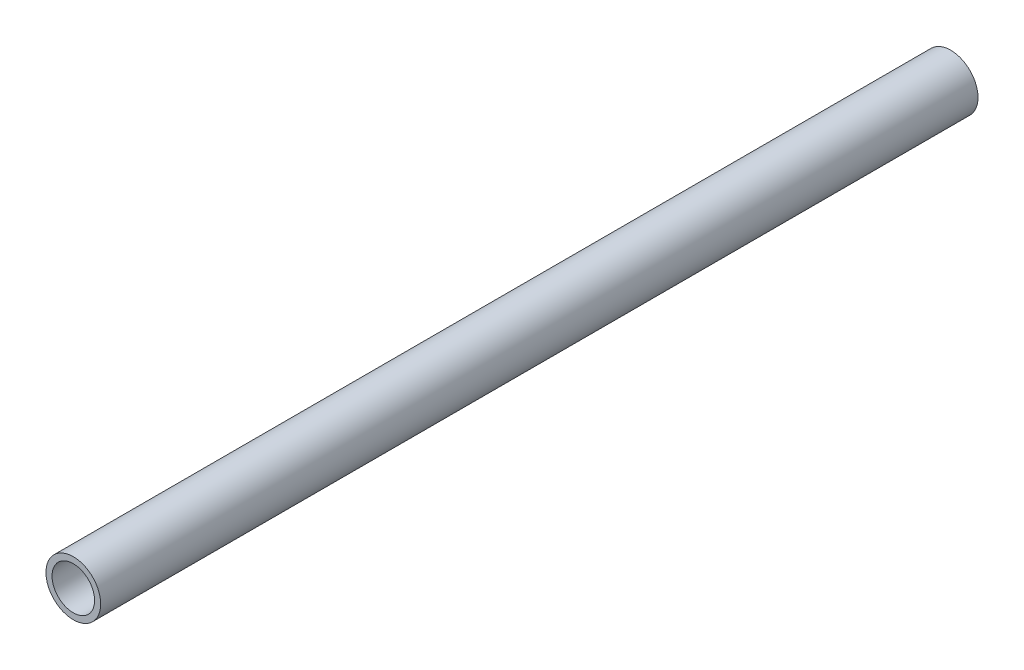
ISO-10303-21;
HEADER;
FILE_DESCRIPTION(('STEP AP214'),'2;1');
FILE_NAME('part.step','',(''),(''),'','','');
FILE_SCHEMA(('AUTOMOTIVE_DESIGN { 1 0 10303 214 1 1 1 1 }'));
ENDSEC;
DATA;
#1=APPLICATION_CONTEXT('core data for automotive mechanical design processes');
#2=APPLICATION_PROTOCOL_DEFINITION('international standard','automotive_design',2000,#1);
#3=PRODUCT_CONTEXT('',#1,'mechanical');
#4=PRODUCT('Part','Part','',(#3));
#5=PRODUCT_RELATED_PRODUCT_CATEGORY('part','',(#4));
#6=PRODUCT_DEFINITION_FORMATION('','',#4);
#7=PRODUCT_DEFINITION_CONTEXT('part definition',#1,'design');
#8=PRODUCT_DEFINITION('design','',#6,#7);
#9=PRODUCT_DEFINITION_SHAPE('','',#8);
#10=(LENGTH_UNIT() NAMED_UNIT(*) SI_UNIT(.MILLI.,.METRE.));
#11=(NAMED_UNIT(*) PLANE_ANGLE_UNIT() SI_UNIT($,.RADIAN.));
#12=(NAMED_UNIT(*) SI_UNIT($,.STERADIAN.) SOLID_ANGLE_UNIT());
#13=UNCERTAINTY_MEASURE_WITH_UNIT(LENGTH_MEASURE(1.E-05),#10,'distance_accuracy_value','');
#14=(GEOMETRIC_REPRESENTATION_CONTEXT(3) GLOBAL_UNCERTAINTY_ASSIGNED_CONTEXT((#13)) GLOBAL_UNIT_ASSIGNED_CONTEXT((#10,
#11,#12)) REPRESENTATION_CONTEXT('',''));
#15=CARTESIAN_POINT('',(0.,0.,0.));
#16=DIRECTION('',(0.,0.,1.));
#17=DIRECTION('',(1.,0.,0.));
#18=AXIS2_PLACEMENT_3D('',#15,#16,#17);
#19=CARTESIAN_POINT('',(0.,0.,288.574));
#20=DIRECTION('',(0.,0.,1.));
#21=DIRECTION('',(1.,0.,0.));
#22=AXIS2_PLACEMENT_3D('',#19,#20,#21);
#23=PLANE('',#22);
#24=CARTESIAN_POINT('',(0.,0.,288.574));
#25=DIRECTION('',(0.,0.,1.));
#26=DIRECTION('',(1.,0.,0.));
#27=AXIS2_PLACEMENT_3D('',#24,#25,#26);
#28=CIRCLE('',#27,9.);
#29=CARTESIAN_POINT('',(9.,0.,288.574));
#30=VERTEX_POINT('',#29);
#31=EDGE_CURVE('E10',#30,#30,#28,.T.);
#32=ORIENTED_EDGE('',*,*,#31,.T.);
#33=EDGE_LOOP('',(#32));
#34=FACE_BOUND('',#33,.T.);
#35=CARTESIAN_POINT('',(0.,0.,288.574));
#36=DIRECTION('',(0.,0.,1.));
#37=DIRECTION('',(1.,0.,0.));
#38=AXIS2_PLACEMENT_3D('',#35,#36,#37);
#39=CIRCLE('',#38,7.);
#40=CARTESIAN_POINT('',(7.,0.,288.574));
#41=VERTEX_POINT('',#40);
#42=EDGE_CURVE('E41',#41,#41,#39,.T.);
#43=ORIENTED_EDGE('',*,*,#42,.F.);
#44=EDGE_LOOP('',(#43));
#45=FACE_BOUND('',#44,.T.);
#46=ADVANCED_FACE('F30',(#34,#45),#23,.T.);
#47=CARTESIAN_POINT('',(0.,0.,0.));
#48=DIRECTION('',(0.,0.,1.));
#49=DIRECTION('',(1.,0.,0.));
#50=AXIS2_PLACEMENT_3D('',#47,#48,#49);
#51=PLANE('',#50);
#52=CARTESIAN_POINT('',(0.,0.,0.));
#53=DIRECTION('',(0.,0.,1.));
#54=DIRECTION('',(1.,0.,0.));
#55=AXIS2_PLACEMENT_3D('',#52,#53,#54);
#56=CIRCLE('',#55,9.);
#57=CARTESIAN_POINT('',(9.,0.,0.));
#58=VERTEX_POINT('',#57);
#59=EDGE_CURVE('E34',#58,#58,#56,.T.);
#60=ORIENTED_EDGE('',*,*,#59,.F.);
#61=EDGE_LOOP('',(#60));
#62=FACE_BOUND('',#61,.T.);
#63=CARTESIAN_POINT('',(0.,0.,0.));
#64=DIRECTION('',(0.,0.,1.));
#65=DIRECTION('',(1.,0.,0.));
#66=AXIS2_PLACEMENT_3D('',#63,#64,#65);
#67=CIRCLE('',#66,7.);
#68=CARTESIAN_POINT('',(7.,0.,0.));
#69=VERTEX_POINT('',#68);
#70=EDGE_CURVE('E43',#69,#69,#67,.T.);
#71=ORIENTED_EDGE('',*,*,#70,.T.);
#72=EDGE_LOOP('',(#71));
#73=FACE_BOUND('',#72,.T.);
#74=ADVANCED_FACE('F53',(#62,#73),#51,.F.);
#75=CARTESIAN_POINT('',(0.,0.,288.574));
#76=DIRECTION('',(0.,0.,-1.));
#77=DIRECTION('',(-1.,0.,0.));
#78=AXIS2_PLACEMENT_3D('',#75,#76,#77);
#79=CYLINDRICAL_SURFACE('',#78,9.);
#80=ORIENTED_EDGE('',*,*,#31,.F.);
#81=EDGE_LOOP('',(#80));
#82=FACE_BOUND('',#81,.T.);
#83=ORIENTED_EDGE('',*,*,#59,.T.);
#84=EDGE_LOOP('',(#83));
#85=FACE_BOUND('',#84,.T.);
#86=ADVANCED_FACE('F32',(#82,#85),#79,.T.);
#87=CARTESIAN_POINT('',(0.,0.,288.574));
#88=DIRECTION('',(0.,0.,-1.));
#89=DIRECTION('',(-1.,0.,0.));
#90=AXIS2_PLACEMENT_3D('',#87,#88,#89);
#91=CYLINDRICAL_SURFACE('',#90,7.);
#92=ORIENTED_EDGE('',*,*,#42,.T.);
#93=EDGE_LOOP('',(#92));
#94=FACE_BOUND('',#93,.T.);
#95=ORIENTED_EDGE('',*,*,#70,.F.);
#96=EDGE_LOOP('',(#95));
#97=FACE_BOUND('',#96,.T.);
#98=ADVANCED_FACE('F49',(#94,#97),#91,.F.);
#99=CLOSED_SHELL('',(#46,#74,#86,#98));
#100=MANIFOLD_SOLID_BREP('B2',#99);
#101=ADVANCED_BREP_SHAPE_REPRESENTATION('',(#18,#100),#14);
#102=SHAPE_DEFINITION_REPRESENTATION(#9,#101);
ENDSEC;
END-ISO-10303-21;
